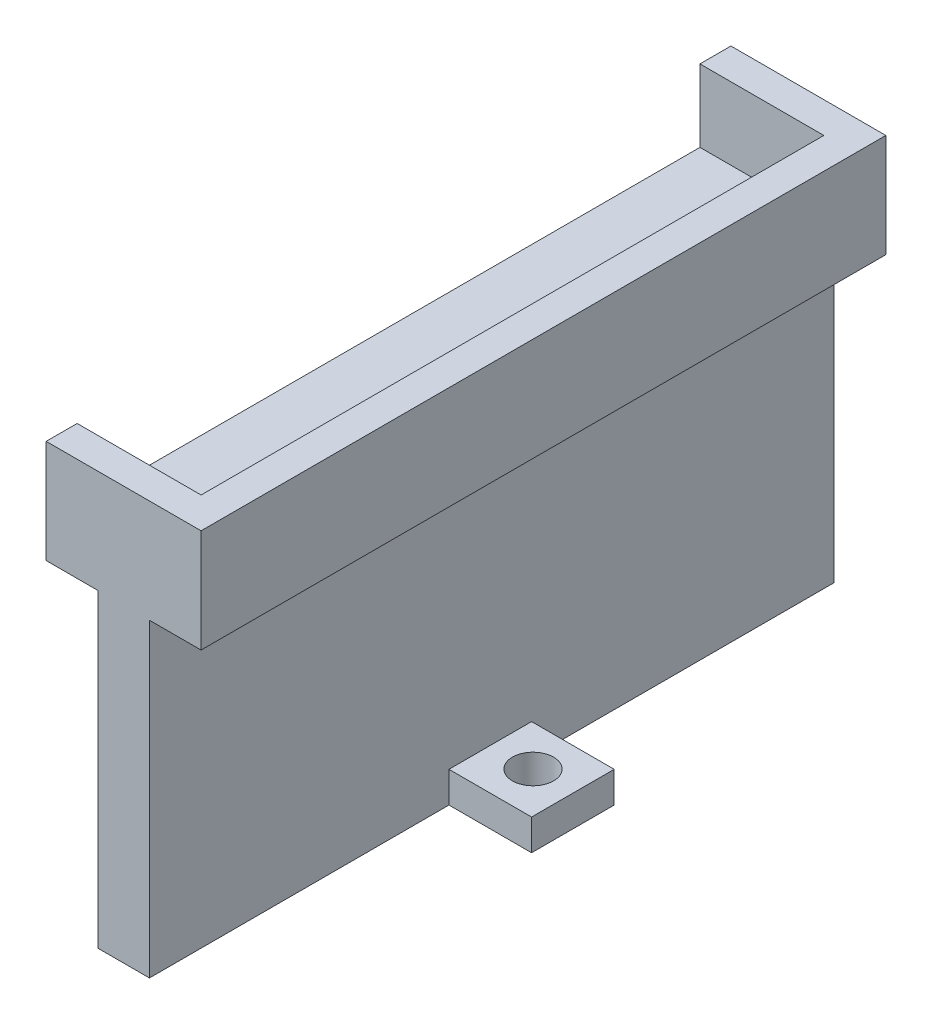
ISO-10303-21;
HEADER;
FILE_DESCRIPTION(('STEP AP214'),'2;1');
FILE_NAME('part.step','',(''),(''),'','','');
FILE_SCHEMA(('AUTOMOTIVE_DESIGN { 1 0 10303 214 1 1 1 1 }'));
ENDSEC;
DATA;
#1=APPLICATION_CONTEXT('core data for automotive mechanical design processes');
#2=APPLICATION_PROTOCOL_DEFINITION('international standard','automotive_design',2000,#1);
#3=PRODUCT_CONTEXT('',#1,'mechanical');
#4=PRODUCT('Part','Part','',(#3));
#5=PRODUCT_RELATED_PRODUCT_CATEGORY('part','',(#4));
#6=PRODUCT_DEFINITION_FORMATION('','',#4);
#7=PRODUCT_DEFINITION_CONTEXT('part definition',#1,'design');
#8=PRODUCT_DEFINITION('design','',#6,#7);
#9=PRODUCT_DEFINITION_SHAPE('','',#8);
#10=(LENGTH_UNIT() NAMED_UNIT(*) SI_UNIT(.MILLI.,.METRE.));
#11=(NAMED_UNIT(*) PLANE_ANGLE_UNIT() SI_UNIT($,.RADIAN.));
#12=(NAMED_UNIT(*) SI_UNIT($,.STERADIAN.) SOLID_ANGLE_UNIT());
#13=UNCERTAINTY_MEASURE_WITH_UNIT(LENGTH_MEASURE(1.E-05),#10,'distance_accuracy_value','');
#14=(GEOMETRIC_REPRESENTATION_CONTEXT(3) GLOBAL_UNCERTAINTY_ASSIGNED_CONTEXT((#13)) GLOBAL_UNIT_ASSIGNED_CONTEXT((#10,
#11,#12)) REPRESENTATION_CONTEXT('',''));
#15=CARTESIAN_POINT('',(0.,0.,0.));
#16=DIRECTION('',(0.,0.,1.));
#17=DIRECTION('',(1.,0.,0.));
#18=AXIS2_PLACEMENT_3D('',#15,#16,#17);
#19=CARTESIAN_POINT('',(54.003861819279,-30.,39.1134711117816));
#20=DIRECTION('',(1.,0.,0.));
#21=DIRECTION('',(0.,0.,-1.));
#22=AXIS2_PLACEMENT_3D('',#19,#20,#21);
#23=PLANE('',#22);
#24=DIRECTION('',(0.,0.,-1.));
#25=VECTOR('',#24,1.);
#26=CARTESIAN_POINT('',(54.003861819279,0.,39.1134711117816));
#27=LINE('',#26,#25);
#28=CARTESIAN_POINT('',(54.003861819279,0.,39.1134711117816));
#29=VERTEX_POINT('',#28);
#30=CARTESIAN_POINT('',(54.003861819279,0.,-27.1865288882184));
#31=VERTEX_POINT('',#30);
#32=EDGE_CURVE('E215',#29,#31,#27,.T.);
#33=ORIENTED_EDGE('',*,*,#32,.T.);
#34=DIRECTION('',(0.,1.,0.));
#35=VECTOR('',#34,1.);
#36=CARTESIAN_POINT('',(54.003861819279,-30.,-27.1865288882184));
#37=LINE('',#36,#35);
#38=CARTESIAN_POINT('',(54.003861819279,-30.,-27.1865288882184));
#39=VERTEX_POINT('',#38);
#40=EDGE_CURVE('E210',#39,#31,#37,.T.);
#41=ORIENTED_EDGE('',*,*,#40,.F.);
#42=DIRECTION('',(0.,0.,-1.));
#43=VECTOR('',#42,1.);
#44=CARTESIAN_POINT('',(54.003861819279,-30.,39.1134711117816));
#45=LINE('',#44,#43);
#46=CARTESIAN_POINT('',(54.003861819279,-30.,39.1134711117816));
#47=VERTEX_POINT('',#46);
#48=EDGE_CURVE('E224',#47,#39,#45,.T.);
#49=ORIENTED_EDGE('',*,*,#48,.F.);
#50=DIRECTION('',(0.,1.,0.));
#51=VECTOR('',#50,1.);
#52=CARTESIAN_POINT('',(54.003861819279,-30.,39.1134711117816));
#53=LINE('',#52,#51);
#54=EDGE_CURVE('E207',#47,#29,#53,.T.);
#55=ORIENTED_EDGE('',*,*,#54,.T.);
#56=EDGE_LOOP('',(#33,#41,#49,#55));
#57=FACE_BOUND('',#56,.T.);
#58=ADVANCED_FACE('F39',(#57),#23,.F.);
#59=CARTESIAN_POINT('',(0.,-30.,0.));
#60=DIRECTION('',(0.,-1.,0.));
#61=DIRECTION('',(0.,0.,-1.));
#62=AXIS2_PLACEMENT_3D('',#59,#60,#61);
#63=PLANE('',#62);
#64=DIRECTION('',(0.,0.,1.));
#65=VECTOR('',#64,1.);
#66=CARTESIAN_POINT('',(59.0038618192789,-30.,39.1134711117816));
#67=LINE('',#66,#65);
#68=CARTESIAN_POINT('',(59.003861819279,-30.,-27.1865288882184));
#69=VERTEX_POINT('',#68);
#70=CARTESIAN_POINT('',(59.003861819279,-30.,2.11347111178159));
#71=VERTEX_POINT('',#70);
#72=EDGE_CURVE('E219',#69,#71,#67,.T.);
#73=ORIENTED_EDGE('',*,*,#72,.T.);
#74=DIRECTION('',(1.,0.,0.));
#75=VECTOR('',#74,1.);
#76=CARTESIAN_POINT('',(67.003861819279,-30.,2.11347111178159));
#77=LINE('',#76,#75);
#78=CARTESIAN_POINT('',(67.003861819279,-30.,2.11347111178159));
#79=VERTEX_POINT('',#78);
#80=EDGE_CURVE('E167',#71,#79,#77,.T.);
#81=ORIENTED_EDGE('',*,*,#80,.T.);
#82=DIRECTION('',(0.,0.,1.));
#83=VECTOR('',#82,1.);
#84=CARTESIAN_POINT('',(67.003861819279,-30.,2.11347111178159));
#85=LINE('',#84,#83);
#86=CARTESIAN_POINT('',(67.003861819279,-30.,10.1134711117816));
#87=VERTEX_POINT('',#86);
#88=EDGE_CURVE('E154',#79,#87,#85,.T.);
#89=ORIENTED_EDGE('',*,*,#88,.T.);
#90=DIRECTION('',(-1.,0.,0.));
#91=VECTOR('',#90,1.);
#92=CARTESIAN_POINT('',(67.003861819279,-30.,10.1134711117816));
#93=LINE('',#92,#91);
#94=CARTESIAN_POINT('',(59.0038618192789,-30.,10.1134711117816));
#95=VERTEX_POINT('',#94);
#96=EDGE_CURVE('E54',#87,#95,#93,.T.);
#97=ORIENTED_EDGE('',*,*,#96,.T.);
#98=CARTESIAN_POINT('',(59.0038618192789,-30.,39.1134711117816));
#99=VERTEX_POINT('',#98);
#100=EDGE_CURVE('E228',#95,#99,#67,.T.);
#101=ORIENTED_EDGE('',*,*,#100,.T.);
#102=DIRECTION('',(-1.,0.,0.));
#103=VECTOR('',#102,1.);
#104=CARTESIAN_POINT('',(54.003861819279,-30.,39.1134711117816));
#105=LINE('',#104,#103);
#106=EDGE_CURVE('E226',#99,#47,#105,.T.);
#107=ORIENTED_EDGE('',*,*,#106,.T.);
#108=ORIENTED_EDGE('',*,*,#48,.T.);
#109=DIRECTION('',(1.,0.,0.));
#110=VECTOR('',#109,1.);
#111=CARTESIAN_POINT('',(54.003861819279,-30.,-27.1865288882184));
#112=LINE('',#111,#110);
#113=EDGE_CURVE('E214',#39,#69,#112,.T.);
#114=ORIENTED_EDGE('',*,*,#113,.T.);
#115=EDGE_LOOP('',(#73,#81,#89,#97,#101,#107,#108,#114));
#116=FACE_BOUND('',#115,.T.);
#117=CARTESIAN_POINT('',(63.0460326764973,-30.,6.02116583114644));
#118=DIRECTION('',(0.,-1.,0.));
#119=DIRECTION('',(0.,0.,-1.));
#120=AXIS2_PLACEMENT_3D('',#117,#118,#119);
#121=CIRCLE('',#120,1.99416254043105);
#122=CARTESIAN_POINT('',(63.0460326764973,-30.,4.02700329071538));
#123=VERTEX_POINT('',#122);
#124=EDGE_CURVE('E187',#123,#123,#121,.T.);
#125=ORIENTED_EDGE('',*,*,#124,.F.);
#126=EDGE_LOOP('',(#125));
#127=FACE_BOUND('',#126,.T.);
#128=ADVANCED_FACE('F165',(#116,#127),#63,.T.);
#129=CARTESIAN_POINT('',(59.0038618192789,-30.,39.1134711117816));
#130=DIRECTION('',(-1.,0.,0.));
#131=DIRECTION('',(0.,0.,1.));
#132=AXIS2_PLACEMENT_3D('',#129,#130,#131);
#133=PLANE('',#132);
#134=ORIENTED_EDGE('',*,*,#100,.F.);
#135=DIRECTION('',(0.,-1.,0.));
#136=VECTOR('',#135,1.);
#137=CARTESIAN_POINT('',(59.003861819279,-27.,10.1134711117816));
#138=LINE('',#137,#136);
#139=CARTESIAN_POINT('',(59.003861819279,-27.,10.1134711117816));
#140=VERTEX_POINT('',#139);
#141=EDGE_CURVE('E162',#140,#95,#138,.T.);
#142=ORIENTED_EDGE('',*,*,#141,.F.);
#143=DIRECTION('',(0.,0.,-1.));
#144=VECTOR('',#143,1.);
#145=CARTESIAN_POINT('',(59.003861819279,-27.,2.11347111178159));
#146=LINE('',#145,#144);
#147=CARTESIAN_POINT('',(59.003861819279,-27.,2.11347111178159));
#148=VERTEX_POINT('',#147);
#149=EDGE_CURVE('E172',#140,#148,#146,.T.);
#150=ORIENTED_EDGE('',*,*,#149,.T.);
#151=DIRECTION('',(0.,-1.,0.));
#152=VECTOR('',#151,1.);
#153=CARTESIAN_POINT('',(59.003861819279,-27.,2.11347111178159));
#154=LINE('',#153,#152);
#155=EDGE_CURVE('E183',#148,#71,#154,.T.);
#156=ORIENTED_EDGE('',*,*,#155,.T.);
#157=ORIENTED_EDGE('',*,*,#72,.F.);
#158=DIRECTION('',(0.,1.,0.));
#159=VECTOR('',#158,1.);
#160=CARTESIAN_POINT('',(59.003861819279,-30.,-27.1865288882184));
#161=LINE('',#160,#159);
#162=CARTESIAN_POINT('',(59.003861819279,0.,-27.1865288882184));
#163=VERTEX_POINT('',#162);
#164=EDGE_CURVE('E212',#69,#163,#161,.T.);
#165=ORIENTED_EDGE('',*,*,#164,.T.);
#166=DIRECTION('',(0.,0.,1.));
#167=VECTOR('',#166,1.);
#168=CARTESIAN_POINT('',(59.0038618192789,0.,39.1134711117816));
#169=LINE('',#168,#167);
#170=CARTESIAN_POINT('',(59.0038618192789,0.,39.1134711117816));
#171=VERTEX_POINT('',#170);
#172=EDGE_CURVE('E218',#163,#171,#169,.T.);
#173=ORIENTED_EDGE('',*,*,#172,.T.);
#174=DIRECTION('',(0.,1.,0.));
#175=VECTOR('',#174,1.);
#176=CARTESIAN_POINT('',(59.0038618192789,-30.,39.1134711117816));
#177=LINE('',#176,#175);
#178=EDGE_CURVE('E205',#99,#171,#177,.T.);
#179=ORIENTED_EDGE('',*,*,#178,.F.);
#180=EDGE_LOOP('',(#134,#142,#150,#156,#157,#165,#173,#179));
#181=FACE_BOUND('',#180,.T.);
#182=ADVANCED_FACE('F315',(#181),#133,.F.);
#183=CARTESIAN_POINT('',(0.,0.,0.));
#184=DIRECTION('',(0.,1.,0.));
#185=DIRECTION('',(0.,0.,1.));
#186=AXIS2_PLACEMENT_3D('',#183,#184,#185);
#187=PLANE('',#186);
#188=ORIENTED_EDGE('',*,*,#172,.F.);
#189=DIRECTION('',(-1.,0.,0.));
#190=VECTOR('',#189,1.);
#191=CARTESIAN_POINT('',(64.0038618192789,0.,-27.1865288882184));
#192=LINE('',#191,#190);
#193=CARTESIAN_POINT('',(64.0038618192789,0.,-27.1865288882184));
#194=VERTEX_POINT('',#193);
#195=EDGE_CURVE('E246',#194,#163,#192,.T.);
#196=ORIENTED_EDGE('',*,*,#195,.F.);
#197=DIRECTION('',(0.,0.,-1.));
#198=VECTOR('',#197,1.);
#199=CARTESIAN_POINT('',(64.0038618192789,0.,39.1134711117816));
#200=LINE('',#199,#198);
#201=CARTESIAN_POINT('',(64.0038618192789,0.,39.1134711117816));
#202=VERTEX_POINT('',#201);
#203=EDGE_CURVE('E254',#202,#194,#200,.T.);
#204=ORIENTED_EDGE('',*,*,#203,.F.);
#205=DIRECTION('',(1.,0.,0.));
#206=VECTOR('',#205,1.);
#207=CARTESIAN_POINT('',(64.0038618192789,0.,39.1134711117816));
#208=LINE('',#207,#206);
#209=EDGE_CURVE('E242',#171,#202,#208,.T.);
#210=ORIENTED_EDGE('',*,*,#209,.F.);
#211=EDGE_LOOP('',(#188,#196,#204,#210));
#212=FACE_BOUND('',#211,.T.);
#213=ADVANCED_FACE('F321',(#212),#187,.F.);
#214=CARTESIAN_POINT('',(64.0038618192789,10.,39.1134711117816));
#215=DIRECTION('',(-1.,0.,0.));
#216=DIRECTION('',(0.,0.,1.));
#217=AXIS2_PLACEMENT_3D('',#214,#215,#216);
#218=PLANE('',#217);
#219=ORIENTED_EDGE('',*,*,#203,.T.);
#220=DIRECTION('',(0.,-1.,0.));
#221=VECTOR('',#220,1.);
#222=CARTESIAN_POINT('',(64.0038618192789,10.,-27.1865288882184));
#223=LINE('',#222,#221);
#224=CARTESIAN_POINT('',(64.0038618192789,10.,-27.1865288882184));
#225=VERTEX_POINT('',#224);
#226=EDGE_CURVE('E251',#225,#194,#223,.T.);
#227=ORIENTED_EDGE('',*,*,#226,.F.);
#228=DIRECTION('',(0.,0.,-1.));
#229=VECTOR('',#228,1.);
#230=CARTESIAN_POINT('',(64.0038618192789,10.,39.1134711117816));
#231=LINE('',#230,#229);
#232=CARTESIAN_POINT('',(64.0038618192789,10.,39.1134711117816));
#233=VERTEX_POINT('',#232);
#234=EDGE_CURVE('E245',#233,#225,#231,.T.);
#235=ORIENTED_EDGE('',*,*,#234,.F.);
#236=DIRECTION('',(0.,-1.,0.));
#237=VECTOR('',#236,1.);
#238=CARTESIAN_POINT('',(64.0038618192789,10.,39.1134711117816));
#239=LINE('',#238,#237);
#240=EDGE_CURVE('E261',#233,#202,#239,.T.);
#241=ORIENTED_EDGE('',*,*,#240,.T.);
#242=EDGE_LOOP('',(#219,#227,#235,#241));
#243=FACE_BOUND('',#242,.T.);
#244=ADVANCED_FACE('F324',(#243),#218,.F.);
#245=CARTESIAN_POINT('',(61.0038618192789,10.000012,36.1134711117816));
#246=DIRECTION('',(-1.,0.,0.));
#247=DIRECTION('',(0.,0.,1.));
#248=AXIS2_PLACEMENT_3D('',#245,#246,#247);
#249=PLANE('',#248);
#250=DIRECTION('',(0.,-1.,0.));
#251=VECTOR('',#250,1.);
#252=CARTESIAN_POINT('',(61.0038618192789,10.000012,-24.1865288882183));
#253=LINE('',#252,#251);
#254=CARTESIAN_POINT('',(61.0038618192789,10.,-24.1865288882183));
#255=VERTEX_POINT('',#254);
#256=CARTESIAN_POINT('',(61.0038618192789,3.,-24.1865288882183));
#257=VERTEX_POINT('',#256);
#258=EDGE_CURVE('E237',#255,#257,#253,.T.);
#259=ORIENTED_EDGE('',*,*,#258,.T.);
#260=DIRECTION('',(0.,0.,-1.));
#261=VECTOR('',#260,1.);
#262=CARTESIAN_POINT('',(61.0038618192789,3.,36.1134711117816));
#263=LINE('',#262,#261);
#264=CARTESIAN_POINT('',(61.0038618192789,3.,36.1134711117816));
#265=VERTEX_POINT('',#264);
#266=EDGE_CURVE('E231',#265,#257,#263,.T.);
#267=ORIENTED_EDGE('',*,*,#266,.F.);
#268=DIRECTION('',(0.,-1.,0.));
#269=VECTOR('',#268,1.);
#270=CARTESIAN_POINT('',(61.0038618192789,10.000012,36.1134711117816));
#271=LINE('',#270,#269);
#272=CARTESIAN_POINT('',(61.0038618192789,10.,36.1134711117816));
#273=VERTEX_POINT('',#272);
#274=EDGE_CURVE('E239',#273,#265,#271,.T.);
#275=ORIENTED_EDGE('',*,*,#274,.F.);
#276=DIRECTION('',(0.,0.,1.));
#277=VECTOR('',#276,1.);
#278=CARTESIAN_POINT('',(61.0038618192789,10.,0.));
#279=LINE('',#278,#277);
#280=EDGE_CURVE('E266',#255,#273,#279,.T.);
#281=ORIENTED_EDGE('',*,*,#280,.F.);
#282=EDGE_LOOP('',(#259,#267,#275,#281));
#283=FACE_BOUND('',#282,.T.);
#284=ADVANCED_FACE('F280',(#283),#249,.T.);
#285=CARTESIAN_POINT('',(0.,3.,0.));
#286=DIRECTION('',(0.,1.,0.));
#287=DIRECTION('',(0.,0.,1.));
#288=AXIS2_PLACEMENT_3D('',#285,#286,#287);
#289=PLANE('',#288);
#290=DIRECTION('',(0.,0.,-1.));
#291=VECTOR('',#290,1.);
#292=CARTESIAN_POINT('',(49.003861819279,3.,0.));
#293=LINE('',#292,#291);
#294=CARTESIAN_POINT('',(49.003861819279,3.,36.1134711117816));
#295=VERTEX_POINT('',#294);
#296=CARTESIAN_POINT('',(49.003861819279,3.,-24.1865288882183));
#297=VERTEX_POINT('',#296);
#298=EDGE_CURVE('E11',#295,#297,#293,.T.);
#299=ORIENTED_EDGE('',*,*,#298,.F.);
#300=DIRECTION('',(1.,0.,0.));
#301=VECTOR('',#300,1.);
#302=CARTESIAN_POINT('',(61.0038618192789,3.,36.1134711117816));
#303=LINE('',#302,#301);
#304=EDGE_CURVE('E222',#295,#265,#303,.T.);
#305=ORIENTED_EDGE('',*,*,#304,.T.);
#306=ORIENTED_EDGE('',*,*,#266,.T.);
#307=DIRECTION('',(-1.,0.,0.));
#308=VECTOR('',#307,1.);
#309=CARTESIAN_POINT('',(61.0038618192789,3.,-24.1865288882183));
#310=LINE('',#309,#308);
#311=EDGE_CURVE('E234',#257,#297,#310,.T.);
#312=ORIENTED_EDGE('',*,*,#311,.T.);
#313=EDGE_LOOP('',(#299,#305,#306,#312));
#314=FACE_BOUND('',#313,.T.);
#315=ADVANCED_FACE('F284',(#314),#289,.T.);
#316=CARTESIAN_POINT('',(61.0038618192789,10.000012,-24.1865288882183));
#317=DIRECTION('',(0.,0.,1.));
#318=DIRECTION('',(1.,0.,0.));
#319=AXIS2_PLACEMENT_3D('',#316,#317,#318);
#320=PLANE('',#319);
#321=DIRECTION('',(0.,1.,0.));
#322=VECTOR('',#321,1.);
#323=CARTESIAN_POINT('',(49.003861819279,10.000012,-24.1865288882183));
#324=LINE('',#323,#322);
#325=CARTESIAN_POINT('',(49.003861819279,10.,-24.1865288882183));
#326=VERTEX_POINT('',#325);
#327=EDGE_CURVE('E198',#297,#326,#324,.T.);
#328=ORIENTED_EDGE('',*,*,#327,.F.);
#329=ORIENTED_EDGE('',*,*,#311,.F.);
#330=ORIENTED_EDGE('',*,*,#258,.F.);
#331=DIRECTION('',(1.,0.,0.));
#332=VECTOR('',#331,1.);
#333=CARTESIAN_POINT('',(0.,10.,-24.1865288882183));
#334=LINE('',#333,#332);
#335=EDGE_CURVE('E264',#326,#255,#334,.T.);
#336=ORIENTED_EDGE('',*,*,#335,.F.);
#337=EDGE_LOOP('',(#328,#329,#330,#336));
#338=FACE_BOUND('',#337,.T.);
#339=ADVANCED_FACE('F287',(#338),#320,.T.);
#340=CARTESIAN_POINT('',(61.0038618192789,10.000012,36.1134711117816));
#341=DIRECTION('',(0.,0.,-1.));
#342=DIRECTION('',(-1.,0.,0.));
#343=AXIS2_PLACEMENT_3D('',#340,#341,#342);
#344=PLANE('',#343);
#345=DIRECTION('',(0.,-1.,0.));
#346=VECTOR('',#345,1.);
#347=CARTESIAN_POINT('',(49.003861819279,10.000012,36.1134711117816));
#348=LINE('',#347,#346);
#349=CARTESIAN_POINT('',(49.003861819279,10.,36.1134711117816));
#350=VERTEX_POINT('',#349);
#351=EDGE_CURVE('E61',#350,#295,#348,.T.);
#352=ORIENTED_EDGE('',*,*,#351,.F.);
#353=DIRECTION('',(-1.,0.,0.));
#354=VECTOR('',#353,1.);
#355=CARTESIAN_POINT('',(0.,10.,36.1134711117816));
#356=LINE('',#355,#354);
#357=EDGE_CURVE('E47',#273,#350,#356,.T.);
#358=ORIENTED_EDGE('',*,*,#357,.F.);
#359=ORIENTED_EDGE('',*,*,#274,.T.);
#360=ORIENTED_EDGE('',*,*,#304,.F.);
#361=EDGE_LOOP('',(#352,#358,#359,#360));
#362=FACE_BOUND('',#361,.T.);
#363=ADVANCED_FACE('F276',(#362),#344,.T.);
#364=CARTESIAN_POINT('',(64.0038618192789,10.,-27.1865288882184));
#365=DIRECTION('',(0.,0.,1.));
#366=DIRECTION('',(1.,0.,0.));
#367=AXIS2_PLACEMENT_3D('',#364,#365,#366);
#368=PLANE('',#367);
#369=CARTESIAN_POINT('',(49.003861819279,0.,-27.1865288882184));
#370=VERTEX_POINT('',#369);
#371=EDGE_CURVE('E256',#31,#370,#192,.T.);
#372=ORIENTED_EDGE('',*,*,#371,.T.);
#373=DIRECTION('',(0.,-1.,0.));
#374=VECTOR('',#373,1.);
#375=CARTESIAN_POINT('',(49.003861819279,30.,-27.1865288882184));
#376=LINE('',#375,#374);
#377=CARTESIAN_POINT('',(49.003861819279,10.,-27.1865288882184));
#378=VERTEX_POINT('',#377);
#379=EDGE_CURVE('E194',#378,#370,#376,.T.);
#380=ORIENTED_EDGE('',*,*,#379,.F.);
#381=DIRECTION('',(-1.,0.,0.));
#382=VECTOR('',#381,1.);
#383=CARTESIAN_POINT('',(64.0038618192789,10.,-27.1865288882184));
#384=LINE('',#383,#382);
#385=EDGE_CURVE('E248',#225,#378,#384,.T.);
#386=ORIENTED_EDGE('',*,*,#385,.F.);
#387=ORIENTED_EDGE('',*,*,#226,.T.);
#388=ORIENTED_EDGE('',*,*,#195,.T.);
#389=ORIENTED_EDGE('',*,*,#164,.F.);
#390=ORIENTED_EDGE('',*,*,#113,.F.);
#391=ORIENTED_EDGE('',*,*,#40,.T.);
#392=EDGE_LOOP('',(#372,#380,#386,#387,#388,#389,#390,#391));
#393=FACE_BOUND('',#392,.T.);
#394=ADVANCED_FACE('F297',(#393),#368,.F.);
#395=CARTESIAN_POINT('',(64.0038618192789,10.,39.1134711117816));
#396=DIRECTION('',(0.,0.,-1.));
#397=DIRECTION('',(-1.,0.,0.));
#398=AXIS2_PLACEMENT_3D('',#395,#396,#397);
#399=PLANE('',#398);
#400=DIRECTION('',(1.,0.,0.));
#401=VECTOR('',#400,1.);
#402=CARTESIAN_POINT('',(64.0038618192789,10.,39.1134711117816));
#403=LINE('',#402,#401);
#404=CARTESIAN_POINT('',(49.003861819279,10.,39.1134711117816));
#405=VERTEX_POINT('',#404);
#406=EDGE_CURVE('E243',#405,#233,#403,.T.);
#407=ORIENTED_EDGE('',*,*,#406,.F.);
#408=DIRECTION('',(0.,-1.,0.));
#409=VECTOR('',#408,1.);
#410=CARTESIAN_POINT('',(49.003861819279,30.,39.1134711117816));
#411=LINE('',#410,#409);
#412=CARTESIAN_POINT('',(49.003861819279,0.,39.1134711117816));
#413=VERTEX_POINT('',#412);
#414=EDGE_CURVE('E195',#405,#413,#411,.T.);
#415=ORIENTED_EDGE('',*,*,#414,.T.);
#416=EDGE_CURVE('E252',#413,#29,#208,.T.);
#417=ORIENTED_EDGE('',*,*,#416,.T.);
#418=ORIENTED_EDGE('',*,*,#54,.F.);
#419=ORIENTED_EDGE('',*,*,#106,.F.);
#420=ORIENTED_EDGE('',*,*,#178,.T.);
#421=ORIENTED_EDGE('',*,*,#209,.T.);
#422=ORIENTED_EDGE('',*,*,#240,.F.);
#423=EDGE_LOOP('',(#407,#415,#417,#418,#419,#420,#421,#422));
#424=FACE_BOUND('',#423,.T.);
#425=ADVANCED_FACE('F41',(#424),#399,.F.);
#426=CARTESIAN_POINT('',(0.,10.,0.));
#427=DIRECTION('',(0.,1.,0.));
#428=DIRECTION('',(0.,0.,1.));
#429=AXIS2_PLACEMENT_3D('',#426,#427,#428);
#430=PLANE('',#429);
#431=DIRECTION('',(0.,0.,-1.));
#432=VECTOR('',#431,1.);
#433=CARTESIAN_POINT('',(49.003861819279,10.,0.));
#434=LINE('',#433,#432);
#435=EDGE_CURVE('E204',#405,#350,#434,.T.);
#436=ORIENTED_EDGE('',*,*,#435,.F.);
#437=ORIENTED_EDGE('',*,*,#406,.T.);
#438=ORIENTED_EDGE('',*,*,#234,.T.);
#439=ORIENTED_EDGE('',*,*,#385,.T.);
#440=EDGE_CURVE('E202',#326,#378,#434,.T.);
#441=ORIENTED_EDGE('',*,*,#440,.F.);
#442=ORIENTED_EDGE('',*,*,#335,.T.);
#443=ORIENTED_EDGE('',*,*,#280,.T.);
#444=ORIENTED_EDGE('',*,*,#357,.T.);
#445=EDGE_LOOP('',(#436,#437,#438,#439,#441,#442,#443,#444));
#446=FACE_BOUND('',#445,.T.);
#447=ADVANCED_FACE('F271',(#446),#430,.T.);
#448=ORIENTED_EDGE('',*,*,#416,.F.);
#449=DIRECTION('',(0.,0.,1.));
#450=VECTOR('',#449,1.);
#451=CARTESIAN_POINT('',(49.003861819279,0.,-27.1865288882184));
#452=LINE('',#451,#450);
#453=EDGE_CURVE('E190',#370,#413,#452,.T.);
#454=ORIENTED_EDGE('',*,*,#453,.F.);
#455=ORIENTED_EDGE('',*,*,#371,.F.);
#456=ORIENTED_EDGE('',*,*,#32,.F.);
#457=EDGE_LOOP('',(#448,#454,#455,#456));
#458=FACE_BOUND('',#457,.T.);
#459=ADVANCED_FACE('F303',(#458),#187,.F.);
#460=CARTESIAN_POINT('',(49.003861819279,30.,-27.1865288882184));
#461=DIRECTION('',(1.,0.,0.));
#462=DIRECTION('',(0.,0.,-1.));
#463=AXIS2_PLACEMENT_3D('',#460,#461,#462);
#464=PLANE('',#463);
#465=ORIENTED_EDGE('',*,*,#435,.T.);
#466=ORIENTED_EDGE('',*,*,#351,.T.);
#467=ORIENTED_EDGE('',*,*,#298,.T.);
#468=ORIENTED_EDGE('',*,*,#327,.T.);
#469=ORIENTED_EDGE('',*,*,#440,.T.);
#470=ORIENTED_EDGE('',*,*,#379,.T.);
#471=ORIENTED_EDGE('',*,*,#453,.T.);
#472=ORIENTED_EDGE('',*,*,#414,.F.);
#473=EDGE_LOOP('',(#465,#466,#467,#468,#469,#470,#471,#472));
#474=FACE_BOUND('',#473,.T.);
#475=ADVANCED_FACE('F290',(#474),#464,.F.);
#476=CARTESIAN_POINT('',(67.003861819279,-27.,10.1134711117816));
#477=DIRECTION('',(0.,0.,1.));
#478=DIRECTION('',(1.,0.,0.));
#479=AXIS2_PLACEMENT_3D('',#476,#477,#478);
#480=PLANE('',#479);
#481=ORIENTED_EDGE('',*,*,#96,.F.);
#482=DIRECTION('',(0.,-1.,0.));
#483=VECTOR('',#482,1.);
#484=CARTESIAN_POINT('',(67.003861819279,-27.,10.1134711117816));
#485=LINE('',#484,#483);
#486=CARTESIAN_POINT('',(67.003861819279,-27.,10.1134711117816));
#487=VERTEX_POINT('',#486);
#488=EDGE_CURVE('E152',#487,#87,#485,.T.);
#489=ORIENTED_EDGE('',*,*,#488,.F.);
#490=DIRECTION('',(-1.,0.,0.));
#491=VECTOR('',#490,1.);
#492=CARTESIAN_POINT('',(67.003861819279,-27.,10.1134711117816));
#493=LINE('',#492,#491);
#494=EDGE_CURVE('E181',#487,#140,#493,.T.);
#495=ORIENTED_EDGE('',*,*,#494,.T.);
#496=ORIENTED_EDGE('',*,*,#141,.T.);
#497=EDGE_LOOP('',(#481,#489,#495,#496));
#498=FACE_BOUND('',#497,.T.);
#499=ADVANCED_FACE('F169',(#498),#480,.T.);
#500=CARTESIAN_POINT('',(67.003861819279,-27.,2.11347111178159));
#501=DIRECTION('',(1.,0.,0.));
#502=DIRECTION('',(0.,0.,-1.));
#503=AXIS2_PLACEMENT_3D('',#500,#501,#502);
#504=PLANE('',#503);
#505=ORIENTED_EDGE('',*,*,#88,.F.);
#506=DIRECTION('',(0.,-1.,0.));
#507=VECTOR('',#506,1.);
#508=CARTESIAN_POINT('',(67.003861819279,-27.,2.11347111178159));
#509=LINE('',#508,#507);
#510=CARTESIAN_POINT('',(67.003861819279,-27.,2.11347111178159));
#511=VERTEX_POINT('',#510);
#512=EDGE_CURVE('E161',#511,#79,#509,.T.);
#513=ORIENTED_EDGE('',*,*,#512,.F.);
#514=DIRECTION('',(0.,0.,1.));
#515=VECTOR('',#514,1.);
#516=CARTESIAN_POINT('',(67.003861819279,-27.,2.11347111178159));
#517=LINE('',#516,#515);
#518=EDGE_CURVE('E157',#511,#487,#517,.T.);
#519=ORIENTED_EDGE('',*,*,#518,.T.);
#520=ORIENTED_EDGE('',*,*,#488,.T.);
#521=EDGE_LOOP('',(#505,#513,#519,#520));
#522=FACE_BOUND('',#521,.T.);
#523=ADVANCED_FACE('F153',(#522),#504,.T.);
#524=CARTESIAN_POINT('',(67.003861819279,-27.,2.11347111178159));
#525=DIRECTION('',(0.,0.,-1.));
#526=DIRECTION('',(-1.,0.,0.));
#527=AXIS2_PLACEMENT_3D('',#524,#525,#526);
#528=PLANE('',#527);
#529=ORIENTED_EDGE('',*,*,#80,.F.);
#530=ORIENTED_EDGE('',*,*,#155,.F.);
#531=DIRECTION('',(1.,0.,0.));
#532=VECTOR('',#531,1.);
#533=CARTESIAN_POINT('',(67.003861819279,-27.,2.11347111178159));
#534=LINE('',#533,#532);
#535=EDGE_CURVE('E175',#148,#511,#534,.T.);
#536=ORIENTED_EDGE('',*,*,#535,.T.);
#537=ORIENTED_EDGE('',*,*,#512,.T.);
#538=EDGE_LOOP('',(#529,#530,#536,#537));
#539=FACE_BOUND('',#538,.T.);
#540=ADVANCED_FACE('F401',(#539),#528,.T.);
#541=CARTESIAN_POINT('',(0.,-27.,0.));
#542=DIRECTION('',(0.,-1.,0.));
#543=DIRECTION('',(0.,0.,-1.));
#544=AXIS2_PLACEMENT_3D('',#541,#542,#543);
#545=PLANE('',#544);
#546=CARTESIAN_POINT('',(63.0460326764973,-27.,6.02116583114644));
#547=DIRECTION('',(0.,-1.,0.));
#548=DIRECTION('',(0.,0.,-1.));
#549=AXIS2_PLACEMENT_3D('',#546,#547,#548);
#550=CIRCLE('',#549,1.99416254043105);
#551=CARTESIAN_POINT('',(63.0460326764973,-27.,4.02700329071538));
#552=VERTEX_POINT('',#551);
#553=EDGE_CURVE('E180',#552,#552,#550,.T.);
#554=ORIENTED_EDGE('',*,*,#553,.T.);
#555=EDGE_LOOP('',(#554));
#556=FACE_BOUND('',#555,.T.);
#557=ORIENTED_EDGE('',*,*,#149,.F.);
#558=ORIENTED_EDGE('',*,*,#494,.F.);
#559=ORIENTED_EDGE('',*,*,#518,.F.);
#560=ORIENTED_EDGE('',*,*,#535,.F.);
#561=EDGE_LOOP('',(#557,#558,#559,#560));
#562=FACE_BOUND('',#561,.T.);
#563=ADVANCED_FACE('F409',(#556,#562),#545,.F.);
#564=CARTESIAN_POINT('',(63.0460326764973,-27.,6.02116583114644));
#565=DIRECTION('',(0.,-1.,0.));
#566=DIRECTION('',(0.,0.,-1.));
#567=AXIS2_PLACEMENT_3D('',#564,#565,#566);
#568=CYLINDRICAL_SURFACE('',#567,1.99416254043105);
#569=ORIENTED_EDGE('',*,*,#553,.F.);
#570=EDGE_LOOP('',(#569));
#571=FACE_BOUND('',#570,.T.);
#572=ORIENTED_EDGE('',*,*,#124,.T.);
#573=EDGE_LOOP('',(#572));
#574=FACE_BOUND('',#573,.T.);
#575=ADVANCED_FACE('F418',(#571,#574),#568,.F.);
#576=CLOSED_SHELL('',(#58,#128,#182,#213,#244,#284,#315,#339,#363,#394,#425,#447,#459,#475,#499,
#523,#540,#563,#575));
#577=MANIFOLD_SOLID_BREP('B2',#576);
#578=ADVANCED_BREP_SHAPE_REPRESENTATION('',(#18,#577),#14);
#579=SHAPE_DEFINITION_REPRESENTATION(#9,#578);
ENDSEC;
END-ISO-10303-21;
